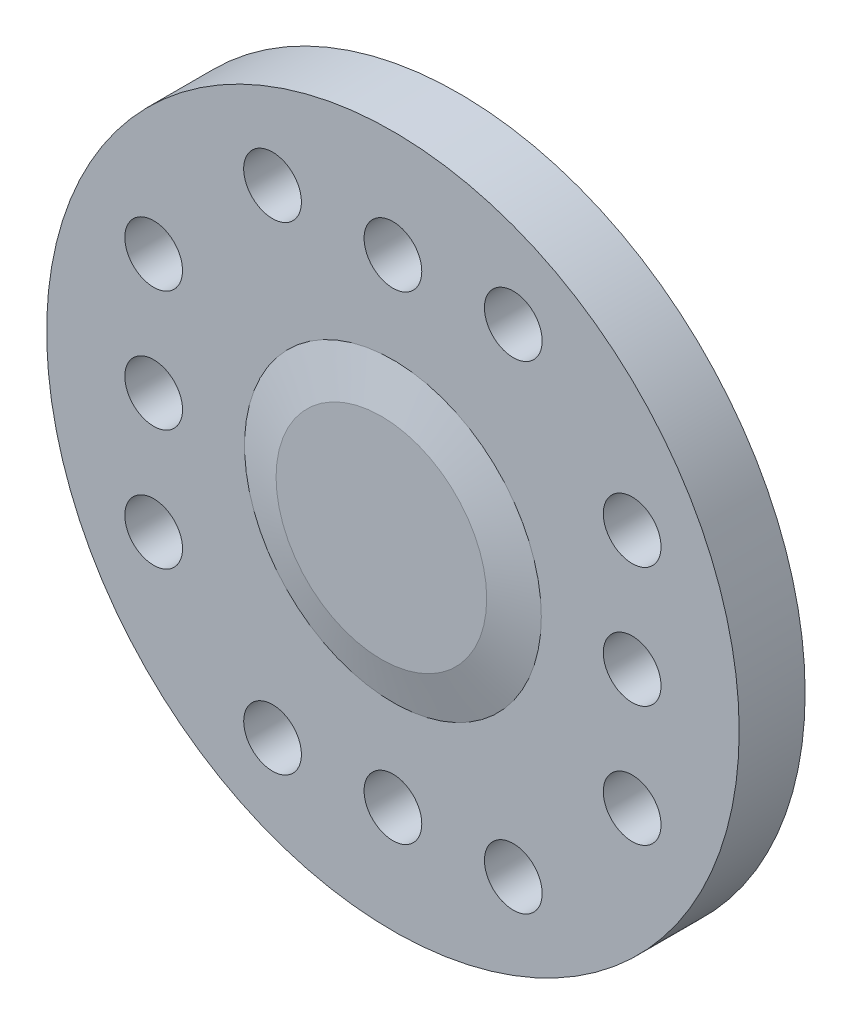
ISO-10303-21;
HEADER;
FILE_DESCRIPTION(('STEP AP214'),'2;1');
FILE_NAME('part.step','',(''),(''),'','','');
FILE_SCHEMA(('AUTOMOTIVE_DESIGN { 1 0 10303 214 1 1 1 1 }'));
ENDSEC;
DATA;
#1=APPLICATION_CONTEXT('core data for automotive mechanical design processes');
#2=APPLICATION_PROTOCOL_DEFINITION('international standard','automotive_design',2000,#1);
#3=PRODUCT_CONTEXT('',#1,'mechanical');
#4=PRODUCT('Part','Part','',(#3));
#5=PRODUCT_RELATED_PRODUCT_CATEGORY('part','',(#4));
#6=PRODUCT_DEFINITION_FORMATION('','',#4);
#7=PRODUCT_DEFINITION_CONTEXT('part definition',#1,'design');
#8=PRODUCT_DEFINITION('design','',#6,#7);
#9=PRODUCT_DEFINITION_SHAPE('','',#8);
#10=(LENGTH_UNIT() NAMED_UNIT(*) SI_UNIT(.MILLI.,.METRE.));
#11=(NAMED_UNIT(*) PLANE_ANGLE_UNIT() SI_UNIT($,.RADIAN.));
#12=(NAMED_UNIT(*) SI_UNIT($,.STERADIAN.) SOLID_ANGLE_UNIT());
#13=UNCERTAINTY_MEASURE_WITH_UNIT(LENGTH_MEASURE(1.E-05),#10,'distance_accuracy_value','');
#14=(GEOMETRIC_REPRESENTATION_CONTEXT(3) GLOBAL_UNCERTAINTY_ASSIGNED_CONTEXT((#13)) GLOBAL_UNIT_ASSIGNED_CONTEXT((#10,
#11,#12)) REPRESENTATION_CONTEXT('',''));
#15=CARTESIAN_POINT('',(0.,0.,0.));
#16=DIRECTION('',(0.,0.,1.));
#17=DIRECTION('',(1.,0.,0.));
#18=AXIS2_PLACEMENT_3D('',#15,#16,#17);
#19=CARTESIAN_POINT('',(0.,0.,0.));
#20=DIRECTION('',(0.,0.,1.));
#21=DIRECTION('',(1.,0.,0.));
#22=AXIS2_PLACEMENT_3D('',#19,#20,#21);
#23=PLANE('',#22);
#24=CARTESIAN_POINT('',(3.65,7.2545,0.));
#25=DIRECTION('',(0.,0.,1.));
#26=DIRECTION('',(-1.,0.,0.));
#27=AXIS2_PLACEMENT_3D('',#24,#25,#26);
#28=CIRCLE('',#27,0.874999999999999);
#29=CARTESIAN_POINT('',(2.775,7.2545,0.));
#30=VERTEX_POINT('',#29);
#31=EDGE_CURVE('E114',#30,#30,#28,.T.);
#32=ORIENTED_EDGE('',*,*,#31,.T.);
#33=EDGE_LOOP('',(#32));
#34=FACE_BOUND('',#33,.T.);
#35=CARTESIAN_POINT('',(-3.65,7.2545,0.));
#36=DIRECTION('',(0.,0.,1.));
#37=DIRECTION('',(1.,0.,0.));
#38=AXIS2_PLACEMENT_3D('',#35,#36,#37);
#39=CIRCLE('',#38,0.875000000000002);
#40=CARTESIAN_POINT('',(-2.775,7.2545,0.));
#41=VERTEX_POINT('',#40);
#42=EDGE_CURVE('E102',#41,#41,#39,.T.);
#43=ORIENTED_EDGE('',*,*,#42,.T.);
#44=EDGE_LOOP('',(#43));
#45=FACE_BOUND('',#44,.T.);
#46=CARTESIAN_POINT('',(-7.2545,0.,0.));
#47=DIRECTION('',(0.,0.,1.));
#48=DIRECTION('',(1.,0.,0.));
#49=AXIS2_PLACEMENT_3D('',#46,#47,#48);
#50=CIRCLE('',#49,0.875000000000002);
#51=CARTESIAN_POINT('',(-6.3795,0.,0.));
#52=VERTEX_POINT('',#51);
#53=EDGE_CURVE('E90',#52,#52,#50,.T.);
#54=ORIENTED_EDGE('',*,*,#53,.T.);
#55=EDGE_LOOP('',(#54));
#56=FACE_BOUND('',#55,.T.);
#57=CARTESIAN_POINT('',(-3.65,-7.2545,0.));
#58=DIRECTION('',(0.,0.,1.));
#59=DIRECTION('',(-1.,0.,0.));
#60=AXIS2_PLACEMENT_3D('',#57,#58,#59);
#61=CIRCLE('',#60,0.874999999999999);
#62=CARTESIAN_POINT('',(-4.525,-7.2545,0.));
#63=VERTEX_POINT('',#62);
#64=EDGE_CURVE('E78',#63,#63,#61,.T.);
#65=ORIENTED_EDGE('',*,*,#64,.T.);
#66=EDGE_LOOP('',(#65));
#67=FACE_BOUND('',#66,.T.);
#68=CARTESIAN_POINT('',(3.65,-7.2545,0.));
#69=DIRECTION('',(0.,0.,1.));
#70=DIRECTION('',(1.,0.,0.));
#71=AXIS2_PLACEMENT_3D('',#68,#69,#70);
#72=CIRCLE('',#71,0.875000000000001);
#73=CARTESIAN_POINT('',(4.525,-7.2545,0.));
#74=VERTEX_POINT('',#73);
#75=EDGE_CURVE('E66',#74,#74,#72,.T.);
#76=ORIENTED_EDGE('',*,*,#75,.T.);
#77=EDGE_LOOP('',(#76));
#78=FACE_BOUND('',#77,.T.);
#79=CARTESIAN_POINT('',(7.2545,0.,0.));
#80=DIRECTION('',(0.,0.,1.));
#81=DIRECTION('',(1.,0.,0.));
#82=AXIS2_PLACEMENT_3D('',#79,#80,#81);
#83=CIRCLE('',#82,0.875);
#84=CARTESIAN_POINT('',(8.1295,0.,0.));
#85=VERTEX_POINT('',#84);
#86=EDGE_CURVE('E54',#85,#85,#83,.T.);
#87=ORIENTED_EDGE('',*,*,#86,.T.);
#88=EDGE_LOOP('',(#87));
#89=FACE_BOUND('',#88,.T.);
#90=CARTESIAN_POINT('',(0.,0.,0.));
#91=DIRECTION('',(0.,0.,1.));
#92=DIRECTION('',(1.,0.,0.));
#93=AXIS2_PLACEMENT_3D('',#90,#91,#92);
#94=CIRCLE('',#93,10.5);
#95=CARTESIAN_POINT('',(10.5,0.,0.));
#96=VERTEX_POINT('',#95);
#97=EDGE_CURVE('E41',#96,#96,#94,.T.);
#98=ORIENTED_EDGE('',*,*,#97,.F.);
#99=EDGE_LOOP('',(#98));
#100=FACE_BOUND('',#99,.T.);
#101=CARTESIAN_POINT('',(7.2545,3.65,0.));
#102=DIRECTION('',(0.,0.,1.));
#103=DIRECTION('',(1.,0.,0.));
#104=AXIS2_PLACEMENT_3D('',#101,#102,#103);
#105=CIRCLE('',#104,0.874999999999998);
#106=CARTESIAN_POINT('',(8.1295,3.65,0.));
#107=VERTEX_POINT('',#106);
#108=EDGE_CURVE('E48',#107,#107,#105,.T.);
#109=ORIENTED_EDGE('',*,*,#108,.T.);
#110=EDGE_LOOP('',(#109));
#111=FACE_BOUND('',#110,.T.);
#112=CARTESIAN_POINT('',(7.2545,-3.65,0.));
#113=DIRECTION('',(0.,0.,1.));
#114=DIRECTION('',(-1.,0.,0.));
#115=AXIS2_PLACEMENT_3D('',#112,#113,#114);
#116=CIRCLE('',#115,0.874999999999998);
#117=CARTESIAN_POINT('',(6.3795,-3.65,0.));
#118=VERTEX_POINT('',#117);
#119=EDGE_CURVE('E60',#118,#118,#116,.T.);
#120=ORIENTED_EDGE('',*,*,#119,.T.);
#121=EDGE_LOOP('',(#120));
#122=FACE_BOUND('',#121,.T.);
#123=CARTESIAN_POINT('',(0.,-7.2545,0.));
#124=DIRECTION('',(0.,0.,1.));
#125=DIRECTION('',(1.,0.,0.));
#126=AXIS2_PLACEMENT_3D('',#123,#124,#125);
#127=CIRCLE('',#126,0.875000000000003);
#128=CARTESIAN_POINT('',(0.875000000000003,-7.2545,0.));
#129=VERTEX_POINT('',#128);
#130=EDGE_CURVE('E72',#129,#129,#127,.T.);
#131=ORIENTED_EDGE('',*,*,#130,.T.);
#132=EDGE_LOOP('',(#131));
#133=FACE_BOUND('',#132,.T.);
#134=CARTESIAN_POINT('',(-7.2545,-3.65,0.));
#135=DIRECTION('',(0.,0.,1.));
#136=DIRECTION('',(1.,0.,0.));
#137=AXIS2_PLACEMENT_3D('',#134,#135,#136);
#138=CIRCLE('',#137,0.875);
#139=CARTESIAN_POINT('',(-6.3795,-3.65,0.));
#140=VERTEX_POINT('',#139);
#141=EDGE_CURVE('E84',#140,#140,#138,.T.);
#142=ORIENTED_EDGE('',*,*,#141,.T.);
#143=EDGE_LOOP('',(#142));
#144=FACE_BOUND('',#143,.T.);
#145=CARTESIAN_POINT('',(-7.2545,3.65,0.));
#146=DIRECTION('',(0.,0.,1.));
#147=DIRECTION('',(-1.,0.,0.));
#148=AXIS2_PLACEMENT_3D('',#145,#146,#147);
#149=CIRCLE('',#148,0.875);
#150=CARTESIAN_POINT('',(-8.1295,3.65,0.));
#151=VERTEX_POINT('',#150);
#152=EDGE_CURVE('E96',#151,#151,#149,.T.);
#153=ORIENTED_EDGE('',*,*,#152,.T.);
#154=EDGE_LOOP('',(#153));
#155=FACE_BOUND('',#154,.T.);
#156=CARTESIAN_POINT('',(0.,7.2545,0.));
#157=DIRECTION('',(0.,0.,1.));
#158=DIRECTION('',(1.,0.,0.));
#159=AXIS2_PLACEMENT_3D('',#156,#157,#158);
#160=CIRCLE('',#159,0.875000000000003);
#161=CARTESIAN_POINT('',(0.875000000000002,7.2545,0.));
#162=VERTEX_POINT('',#161);
#163=EDGE_CURVE('E108',#162,#162,#160,.T.);
#164=ORIENTED_EDGE('',*,*,#163,.T.);
#165=EDGE_LOOP('',(#164));
#166=FACE_BOUND('',#165,.T.);
#167=CARTESIAN_POINT('',(0.,0.,0.));
#168=DIRECTION('',(0.,0.,1.));
#169=DIRECTION('',(1.,0.,0.));
#170=AXIS2_PLACEMENT_3D('',#167,#168,#169);
#171=CIRCLE('',#170,4.);
#172=CARTESIAN_POINT('',(4.,0.,0.));
#173=VERTEX_POINT('',#172);
#174=EDGE_CURVE('E10',#173,#173,#171,.F.);
#175=ORIENTED_EDGE('',*,*,#174,.F.);
#176=EDGE_LOOP('',(#175));
#177=FACE_BOUND('',#176,.T.);
#178=ADVANCED_FACE('F30',(#34,#45,#56,#67,#78,#89,#100,#111,#122,#133,#144,#155,#166,#177),#23,.F.);
#179=CARTESIAN_POINT('',(0.,0.,2.));
#180=DIRECTION('',(0.,0.,1.));
#181=DIRECTION('',(1.,0.,0.));
#182=AXIS2_PLACEMENT_3D('',#179,#180,#181);
#183=PLANE('',#182);
#184=CARTESIAN_POINT('',(3.65,7.2545,2.));
#185=DIRECTION('',(0.,0.,1.));
#186=DIRECTION('',(-1.,0.,0.));
#187=AXIS2_PLACEMENT_3D('',#184,#185,#186);
#188=CIRCLE('',#187,0.874999999999999);
#189=CARTESIAN_POINT('',(2.775,7.2545,2.));
#190=VERTEX_POINT('',#189);
#191=EDGE_CURVE('E111',#190,#190,#188,.T.);
#192=ORIENTED_EDGE('',*,*,#191,.F.);
#193=EDGE_LOOP('',(#192));
#194=FACE_BOUND('',#193,.T.);
#195=CARTESIAN_POINT('',(-3.65,7.2545,2.));
#196=DIRECTION('',(0.,0.,1.));
#197=DIRECTION('',(1.,0.,0.));
#198=AXIS2_PLACEMENT_3D('',#195,#196,#197);
#199=CIRCLE('',#198,0.875000000000002);
#200=CARTESIAN_POINT('',(-2.775,7.2545,2.));
#201=VERTEX_POINT('',#200);
#202=EDGE_CURVE('E99',#201,#201,#199,.T.);
#203=ORIENTED_EDGE('',*,*,#202,.F.);
#204=EDGE_LOOP('',(#203));
#205=FACE_BOUND('',#204,.T.);
#206=CARTESIAN_POINT('',(-7.2545,0.,2.));
#207=DIRECTION('',(0.,0.,1.));
#208=DIRECTION('',(1.,0.,0.));
#209=AXIS2_PLACEMENT_3D('',#206,#207,#208);
#210=CIRCLE('',#209,0.875000000000002);
#211=CARTESIAN_POINT('',(-6.3795,0.,2.));
#212=VERTEX_POINT('',#211);
#213=EDGE_CURVE('E87',#212,#212,#210,.T.);
#214=ORIENTED_EDGE('',*,*,#213,.F.);
#215=EDGE_LOOP('',(#214));
#216=FACE_BOUND('',#215,.T.);
#217=CARTESIAN_POINT('',(-3.65,-7.2545,2.));
#218=DIRECTION('',(0.,0.,1.));
#219=DIRECTION('',(-1.,0.,0.));
#220=AXIS2_PLACEMENT_3D('',#217,#218,#219);
#221=CIRCLE('',#220,0.874999999999999);
#222=CARTESIAN_POINT('',(-4.525,-7.2545,2.));
#223=VERTEX_POINT('',#222);
#224=EDGE_CURVE('E75',#223,#223,#221,.T.);
#225=ORIENTED_EDGE('',*,*,#224,.F.);
#226=EDGE_LOOP('',(#225));
#227=FACE_BOUND('',#226,.T.);
#228=CARTESIAN_POINT('',(3.65,-7.2545,2.));
#229=DIRECTION('',(0.,0.,1.));
#230=DIRECTION('',(1.,0.,0.));
#231=AXIS2_PLACEMENT_3D('',#228,#229,#230);
#232=CIRCLE('',#231,0.875000000000001);
#233=CARTESIAN_POINT('',(4.525,-7.2545,2.));
#234=VERTEX_POINT('',#233);
#235=EDGE_CURVE('E63',#234,#234,#232,.T.);
#236=ORIENTED_EDGE('',*,*,#235,.F.);
#237=EDGE_LOOP('',(#236));
#238=FACE_BOUND('',#237,.T.);
#239=CARTESIAN_POINT('',(7.2545,0.,2.));
#240=DIRECTION('',(0.,0.,1.));
#241=DIRECTION('',(1.,0.,0.));
#242=AXIS2_PLACEMENT_3D('',#239,#240,#241);
#243=CIRCLE('',#242,0.875);
#244=CARTESIAN_POINT('',(8.1295,0.,2.));
#245=VERTEX_POINT('',#244);
#246=EDGE_CURVE('E51',#245,#245,#243,.T.);
#247=ORIENTED_EDGE('',*,*,#246,.F.);
#248=EDGE_LOOP('',(#247));
#249=FACE_BOUND('',#248,.T.);
#250=CARTESIAN_POINT('',(0.,0.,2.));
#251=DIRECTION('',(0.,0.,1.));
#252=DIRECTION('',(1.,0.,0.));
#253=AXIS2_PLACEMENT_3D('',#250,#251,#252);
#254=CIRCLE('',#253,10.5);
#255=CARTESIAN_POINT('',(10.5,0.,2.));
#256=VERTEX_POINT('',#255);
#257=EDGE_CURVE('E37',#256,#256,#254,.T.);
#258=ORIENTED_EDGE('',*,*,#257,.T.);
#259=EDGE_LOOP('',(#258));
#260=FACE_BOUND('',#259,.T.);
#261=CARTESIAN_POINT('',(7.2545,3.65,2.));
#262=DIRECTION('',(0.,0.,1.));
#263=DIRECTION('',(1.,0.,0.));
#264=AXIS2_PLACEMENT_3D('',#261,#262,#263);
#265=CIRCLE('',#264,0.874999999999998);
#266=CARTESIAN_POINT('',(8.1295,3.65,2.));
#267=VERTEX_POINT('',#266);
#268=EDGE_CURVE('E46',#267,#267,#265,.T.);
#269=ORIENTED_EDGE('',*,*,#268,.F.);
#270=EDGE_LOOP('',(#269));
#271=FACE_BOUND('',#270,.T.);
#272=CARTESIAN_POINT('',(7.2545,-3.65,2.));
#273=DIRECTION('',(0.,0.,1.));
#274=DIRECTION('',(-1.,0.,0.));
#275=AXIS2_PLACEMENT_3D('',#272,#273,#274);
#276=CIRCLE('',#275,0.874999999999998);
#277=CARTESIAN_POINT('',(6.3795,-3.65,2.));
#278=VERTEX_POINT('',#277);
#279=EDGE_CURVE('E57',#278,#278,#276,.T.);
#280=ORIENTED_EDGE('',*,*,#279,.F.);
#281=EDGE_LOOP('',(#280));
#282=FACE_BOUND('',#281,.T.);
#283=CARTESIAN_POINT('',(0.,-7.2545,2.));
#284=DIRECTION('',(0.,0.,1.));
#285=DIRECTION('',(1.,0.,0.));
#286=AXIS2_PLACEMENT_3D('',#283,#284,#285);
#287=CIRCLE('',#286,0.875000000000003);
#288=CARTESIAN_POINT('',(0.875000000000003,-7.2545,2.));
#289=VERTEX_POINT('',#288);
#290=EDGE_CURVE('E69',#289,#289,#287,.T.);
#291=ORIENTED_EDGE('',*,*,#290,.F.);
#292=EDGE_LOOP('',(#291));
#293=FACE_BOUND('',#292,.T.);
#294=CARTESIAN_POINT('',(-7.2545,-3.65,2.));
#295=DIRECTION('',(0.,0.,1.));
#296=DIRECTION('',(1.,0.,0.));
#297=AXIS2_PLACEMENT_3D('',#294,#295,#296);
#298=CIRCLE('',#297,0.875);
#299=CARTESIAN_POINT('',(-6.3795,-3.65,2.));
#300=VERTEX_POINT('',#299);
#301=EDGE_CURVE('E81',#300,#300,#298,.T.);
#302=ORIENTED_EDGE('',*,*,#301,.F.);
#303=EDGE_LOOP('',(#302));
#304=FACE_BOUND('',#303,.T.);
#305=CARTESIAN_POINT('',(-7.2545,3.65,2.));
#306=DIRECTION('',(0.,0.,1.));
#307=DIRECTION('',(-1.,0.,0.));
#308=AXIS2_PLACEMENT_3D('',#305,#306,#307);
#309=CIRCLE('',#308,0.875);
#310=CARTESIAN_POINT('',(-8.1295,3.65,2.));
#311=VERTEX_POINT('',#310);
#312=EDGE_CURVE('E93',#311,#311,#309,.T.);
#313=ORIENTED_EDGE('',*,*,#312,.F.);
#314=EDGE_LOOP('',(#313));
#315=FACE_BOUND('',#314,.T.);
#316=CARTESIAN_POINT('',(0.,7.2545,2.));
#317=DIRECTION('',(0.,0.,1.));
#318=DIRECTION('',(1.,0.,0.));
#319=AXIS2_PLACEMENT_3D('',#316,#317,#318);
#320=CIRCLE('',#319,0.875000000000003);
#321=CARTESIAN_POINT('',(0.875000000000002,7.2545,2.));
#322=VERTEX_POINT('',#321);
#323=EDGE_CURVE('E105',#322,#322,#320,.T.);
#324=ORIENTED_EDGE('',*,*,#323,.F.);
#325=EDGE_LOOP('',(#324));
#326=FACE_BOUND('',#325,.T.);
#327=CARTESIAN_POINT('',(0.,0.,2.));
#328=DIRECTION('',(0.,0.,1.));
#329=DIRECTION('',(1.,0.,0.));
#330=AXIS2_PLACEMENT_3D('',#327,#328,#329);
#331=CIRCLE('',#330,4.5);
#332=CARTESIAN_POINT('',(4.5,0.,2.));
#333=VERTEX_POINT('',#332);
#334=EDGE_CURVE('E122',#333,#333,#331,.T.);
#335=ORIENTED_EDGE('',*,*,#334,.F.);
#336=EDGE_LOOP('',(#335));
#337=FACE_BOUND('',#336,.T.);
#338=ADVANCED_FACE('F160',(#194,#205,#216,#227,#238,#249,#260,#271,#282,#293,#304,#315,#326,
#337),#183,.T.);
#339=CARTESIAN_POINT('',(0.,0.,2.));
#340=DIRECTION('',(0.,0.,-1.));
#341=DIRECTION('',(-1.,0.,0.));
#342=AXIS2_PLACEMENT_3D('',#339,#340,#341);
#343=CYLINDRICAL_SURFACE('',#342,10.5);
#344=ORIENTED_EDGE('',*,*,#257,.F.);
#345=EDGE_LOOP('',(#344));
#346=FACE_BOUND('',#345,.T.);
#347=ORIENTED_EDGE('',*,*,#97,.T.);
#348=EDGE_LOOP('',(#347));
#349=FACE_BOUND('',#348,.T.);
#350=ADVANCED_FACE('F32',(#346,#349),#343,.T.);
#351=CARTESIAN_POINT('',(7.2545,3.65,2.));
#352=DIRECTION('',(0.,0.,-1.));
#353=DIRECTION('',(-1.,0.,0.));
#354=AXIS2_PLACEMENT_3D('',#351,#352,#353);
#355=CYLINDRICAL_SURFACE('',#354,0.874999999999998);
#356=ORIENTED_EDGE('',*,*,#268,.T.);
#357=EDGE_LOOP('',(#356));
#358=FACE_BOUND('',#357,.T.);
#359=ORIENTED_EDGE('',*,*,#108,.F.);
#360=EDGE_LOOP('',(#359));
#361=FACE_BOUND('',#360,.T.);
#362=ADVANCED_FACE('F169',(#358,#361),#355,.F.);
#363=CARTESIAN_POINT('',(7.2545,0.,2.));
#364=DIRECTION('',(0.,0.,-1.));
#365=DIRECTION('',(-1.,0.,0.));
#366=AXIS2_PLACEMENT_3D('',#363,#364,#365);
#367=CYLINDRICAL_SURFACE('',#366,0.875);
#368=ORIENTED_EDGE('',*,*,#246,.T.);
#369=EDGE_LOOP('',(#368));
#370=FACE_BOUND('',#369,.T.);
#371=ORIENTED_EDGE('',*,*,#86,.F.);
#372=EDGE_LOOP('',(#371));
#373=FACE_BOUND('',#372,.T.);
#374=ADVANCED_FACE('F172',(#370,#373),#367,.F.);
#375=CARTESIAN_POINT('',(7.2545,-3.65,2.));
#376=DIRECTION('',(0.,0.,-1.));
#377=DIRECTION('',(-1.,0.,0.));
#378=AXIS2_PLACEMENT_3D('',#375,#376,#377);
#379=CYLINDRICAL_SURFACE('',#378,0.874999999999998);
#380=ORIENTED_EDGE('',*,*,#279,.T.);
#381=EDGE_LOOP('',(#380));
#382=FACE_BOUND('',#381,.T.);
#383=ORIENTED_EDGE('',*,*,#119,.F.);
#384=EDGE_LOOP('',(#383));
#385=FACE_BOUND('',#384,.T.);
#386=ADVANCED_FACE('F176',(#382,#385),#379,.F.);
#387=CARTESIAN_POINT('',(3.65,-7.2545,2.));
#388=DIRECTION('',(0.,0.,-1.));
#389=DIRECTION('',(-1.,0.,0.));
#390=AXIS2_PLACEMENT_3D('',#387,#388,#389);
#391=CYLINDRICAL_SURFACE('',#390,0.875000000000001);
#392=ORIENTED_EDGE('',*,*,#235,.T.);
#393=EDGE_LOOP('',(#392));
#394=FACE_BOUND('',#393,.T.);
#395=ORIENTED_EDGE('',*,*,#75,.F.);
#396=EDGE_LOOP('',(#395));
#397=FACE_BOUND('',#396,.T.);
#398=ADVANCED_FACE('F180',(#394,#397),#391,.F.);
#399=CARTESIAN_POINT('',(0.,-7.2545,2.));
#400=DIRECTION('',(0.,0.,-1.));
#401=DIRECTION('',(-1.,0.,0.));
#402=AXIS2_PLACEMENT_3D('',#399,#400,#401);
#403=CYLINDRICAL_SURFACE('',#402,0.875000000000003);
#404=ORIENTED_EDGE('',*,*,#290,.T.);
#405=EDGE_LOOP('',(#404));
#406=FACE_BOUND('',#405,.T.);
#407=ORIENTED_EDGE('',*,*,#130,.F.);
#408=EDGE_LOOP('',(#407));
#409=FACE_BOUND('',#408,.T.);
#410=ADVANCED_FACE('F184',(#406,#409),#403,.F.);
#411=CARTESIAN_POINT('',(-3.65,-7.2545,2.));
#412=DIRECTION('',(0.,0.,-1.));
#413=DIRECTION('',(-1.,0.,0.));
#414=AXIS2_PLACEMENT_3D('',#411,#412,#413);
#415=CYLINDRICAL_SURFACE('',#414,0.874999999999999);
#416=ORIENTED_EDGE('',*,*,#224,.T.);
#417=EDGE_LOOP('',(#416));
#418=FACE_BOUND('',#417,.T.);
#419=ORIENTED_EDGE('',*,*,#64,.F.);
#420=EDGE_LOOP('',(#419));
#421=FACE_BOUND('',#420,.T.);
#422=ADVANCED_FACE('F188',(#418,#421),#415,.F.);
#423=CARTESIAN_POINT('',(-7.2545,-3.65,2.));
#424=DIRECTION('',(0.,0.,-1.));
#425=DIRECTION('',(-1.,0.,0.));
#426=AXIS2_PLACEMENT_3D('',#423,#424,#425);
#427=CYLINDRICAL_SURFACE('',#426,0.875);
#428=ORIENTED_EDGE('',*,*,#301,.T.);
#429=EDGE_LOOP('',(#428));
#430=FACE_BOUND('',#429,.T.);
#431=ORIENTED_EDGE('',*,*,#141,.F.);
#432=EDGE_LOOP('',(#431));
#433=FACE_BOUND('',#432,.T.);
#434=ADVANCED_FACE('F192',(#430,#433),#427,.F.);
#435=CARTESIAN_POINT('',(-7.2545,0.,2.));
#436=DIRECTION('',(0.,0.,-1.));
#437=DIRECTION('',(-1.,0.,0.));
#438=AXIS2_PLACEMENT_3D('',#435,#436,#437);
#439=CYLINDRICAL_SURFACE('',#438,0.875000000000002);
#440=ORIENTED_EDGE('',*,*,#213,.T.);
#441=EDGE_LOOP('',(#440));
#442=FACE_BOUND('',#441,.T.);
#443=ORIENTED_EDGE('',*,*,#53,.F.);
#444=EDGE_LOOP('',(#443));
#445=FACE_BOUND('',#444,.T.);
#446=ADVANCED_FACE('F196',(#442,#445),#439,.F.);
#447=CARTESIAN_POINT('',(-7.2545,3.65,2.));
#448=DIRECTION('',(0.,0.,-1.));
#449=DIRECTION('',(-1.,0.,0.));
#450=AXIS2_PLACEMENT_3D('',#447,#448,#449);
#451=CYLINDRICAL_SURFACE('',#450,0.875);
#452=ORIENTED_EDGE('',*,*,#312,.T.);
#453=EDGE_LOOP('',(#452));
#454=FACE_BOUND('',#453,.T.);
#455=ORIENTED_EDGE('',*,*,#152,.F.);
#456=EDGE_LOOP('',(#455));
#457=FACE_BOUND('',#456,.T.);
#458=ADVANCED_FACE('F200',(#454,#457),#451,.F.);
#459=CARTESIAN_POINT('',(-3.65,7.2545,2.));
#460=DIRECTION('',(0.,0.,-1.));
#461=DIRECTION('',(-1.,0.,0.));
#462=AXIS2_PLACEMENT_3D('',#459,#460,#461);
#463=CYLINDRICAL_SURFACE('',#462,0.875000000000002);
#464=ORIENTED_EDGE('',*,*,#202,.T.);
#465=EDGE_LOOP('',(#464));
#466=FACE_BOUND('',#465,.T.);
#467=ORIENTED_EDGE('',*,*,#42,.F.);
#468=EDGE_LOOP('',(#467));
#469=FACE_BOUND('',#468,.T.);
#470=ADVANCED_FACE('F204',(#466,#469),#463,.F.);
#471=CARTESIAN_POINT('',(0.,7.2545,2.));
#472=DIRECTION('',(0.,0.,-1.));
#473=DIRECTION('',(-1.,0.,0.));
#474=AXIS2_PLACEMENT_3D('',#471,#472,#473);
#475=CYLINDRICAL_SURFACE('',#474,0.875000000000003);
#476=ORIENTED_EDGE('',*,*,#323,.T.);
#477=EDGE_LOOP('',(#476));
#478=FACE_BOUND('',#477,.T.);
#479=ORIENTED_EDGE('',*,*,#163,.F.);
#480=EDGE_LOOP('',(#479));
#481=FACE_BOUND('',#480,.T.);
#482=ADVANCED_FACE('F208',(#478,#481),#475,.F.);
#483=CARTESIAN_POINT('',(3.65,7.2545,2.));
#484=DIRECTION('',(0.,0.,-1.));
#485=DIRECTION('',(-1.,0.,0.));
#486=AXIS2_PLACEMENT_3D('',#483,#484,#485);
#487=CYLINDRICAL_SURFACE('',#486,0.874999999999999);
#488=ORIENTED_EDGE('',*,*,#191,.T.);
#489=EDGE_LOOP('',(#488));
#490=FACE_BOUND('',#489,.T.);
#491=ORIENTED_EDGE('',*,*,#31,.F.);
#492=EDGE_LOOP('',(#491));
#493=FACE_BOUND('',#492,.T.);
#494=ADVANCED_FACE('F212',(#490,#493),#487,.F.);
#495=CARTESIAN_POINT('',(0.,0.,2.));
#496=DIRECTION('',(0.,0.,-1.));
#497=DIRECTION('',(1.,0.,0.));
#498=AXIS2_PLACEMENT_3D('',#495,#496,#497);
#499=CONICAL_SURFACE('',#498,4.5,1.30899693899575);
#500=CARTESIAN_POINT('',(0.,0.,2.35));
#501=DIRECTION('',(0.,0.,1.));
#502=DIRECTION('',(1.,0.,0.));
#503=AXIS2_PLACEMENT_3D('',#500,#501,#502);
#504=CIRCLE('',#503,3.19378221735088);
#505=CARTESIAN_POINT('',(3.19378221735088,0.,2.35));
#506=VERTEX_POINT('',#505);
#507=EDGE_CURVE('E117',#506,#506,#504,.T.);
#508=ORIENTED_EDGE('',*,*,#507,.F.);
#509=EDGE_LOOP('',(#508));
#510=FACE_BOUND('',#509,.T.);
#511=ORIENTED_EDGE('',*,*,#334,.T.);
#512=EDGE_LOOP('',(#511));
#513=FACE_BOUND('',#512,.T.);
#514=ADVANCED_FACE('F156',(#510,#513),#499,.T.);
#515=CARTESIAN_POINT('',(0.,0.,2.35));
#516=DIRECTION('',(0.,0.,1.));
#517=DIRECTION('',(1.,0.,0.));
#518=AXIS2_PLACEMENT_3D('',#515,#516,#517);
#519=PLANE('',#518);
#520=ORIENTED_EDGE('',*,*,#507,.T.);
#521=EDGE_LOOP('',(#520));
#522=FACE_BOUND('',#521,.T.);
#523=ADVANCED_FACE('F151',(#522),#519,.T.);
#524=CARTESIAN_POINT('',(0.,0.,-3.4));
#525=DIRECTION('',(0.,0.,1.));
#526=DIRECTION('',(1.,0.,0.));
#527=AXIS2_PLACEMENT_3D('',#524,#525,#526);
#528=CYLINDRICAL_SURFACE('',#527,4.);
#529=CARTESIAN_POINT('',(0.,0.,-3.4));
#530=DIRECTION('',(0.,0.,-1.));
#531=DIRECTION('',(-1.,0.,0.));
#532=AXIS2_PLACEMENT_3D('',#529,#530,#531);
#533=CIRCLE('',#532,4.);
#534=CARTESIAN_POINT('',(-4.,0.,-3.4));
#535=VERTEX_POINT('',#534);
#536=EDGE_CURVE('E125',#535,#535,#533,.T.);
#537=ORIENTED_EDGE('',*,*,#536,.F.);
#538=EDGE_LOOP('',(#537));
#539=FACE_BOUND('',#538,.T.);
#540=ORIENTED_EDGE('',*,*,#174,.T.);
#541=EDGE_LOOP('',(#540));
#542=FACE_BOUND('',#541,.T.);
#543=ADVANCED_FACE('F146',(#539,#542),#528,.T.);
#544=CARTESIAN_POINT('',(0.,0.,-3.4));
#545=DIRECTION('',(0.,0.,-1.));
#546=DIRECTION('',(-1.,0.,0.));
#547=AXIS2_PLACEMENT_3D('',#544,#545,#546);
#548=PLANE('',#547);
#549=CARTESIAN_POINT('',(0.,0.,-3.4));
#550=DIRECTION('',(0.,0.,-1.));
#551=DIRECTION('',(-1.,0.,0.));
#552=AXIS2_PLACEMENT_3D('',#549,#550,#551);
#553=CIRCLE('',#552,2.85);
#554=CARTESIAN_POINT('',(-2.85,0.,-3.4));
#555=VERTEX_POINT('',#554);
#556=EDGE_CURVE('E129',#555,#555,#553,.T.);
#557=ORIENTED_EDGE('',*,*,#556,.F.);
#558=EDGE_LOOP('',(#557));
#559=FACE_BOUND('',#558,.T.);
#560=ORIENTED_EDGE('',*,*,#536,.T.);
#561=EDGE_LOOP('',(#560));
#562=FACE_BOUND('',#561,.T.);
#563=ADVANCED_FACE('F140',(#559,#562),#548,.T.);
#564=CARTESIAN_POINT('',(0.,0.,0.4));
#565=DIRECTION('',(0.,0.,-1.));
#566=DIRECTION('',(-1.,0.,0.));
#567=AXIS2_PLACEMENT_3D('',#564,#565,#566);
#568=CYLINDRICAL_SURFACE('',#567,2.85);
#569=CARTESIAN_POINT('',(0.,0.,0.4));
#570=DIRECTION('',(0.,0.,-1.));
#571=DIRECTION('',(-1.,0.,0.));
#572=AXIS2_PLACEMENT_3D('',#569,#570,#571);
#573=CIRCLE('',#572,2.85);
#574=CARTESIAN_POINT('',(-2.85,0.,0.4));
#575=VERTEX_POINT('',#574);
#576=EDGE_CURVE('E128',#575,#575,#573,.T.);
#577=CARTESIAN_POINT('',(-2.85,0.,0.4));
#578=CARTESIAN_POINT('',(-2.85,0.,0.360416666666667));
#579=CARTESIAN_POINT('',(-2.85,0.,0.320833333333334));
#580=CARTESIAN_POINT('',(-2.85,0.,0.241666666666667));
#581=CARTESIAN_POINT('',(-2.85,0.,0.202083333333334));
#582=CARTESIAN_POINT('',(-2.85,0.,0.122916666666667));
#583=CARTESIAN_POINT('',(-2.85,0.,0.0833333333333336));
#584=CARTESIAN_POINT('',(-2.85,0.,0.00416666666666688));
#585=CARTESIAN_POINT('',(-2.85,0.,-0.0354166666666665));
#586=CARTESIAN_POINT('',(-2.85,0.,-0.114583333333333));
#587=CARTESIAN_POINT('',(-2.85,0.,-0.154166666666666));
#588=CARTESIAN_POINT('',(-2.85,0.,-0.233333333333333));
#589=CARTESIAN_POINT('',(-2.85,0.,-0.272916666666666));
#590=CARTESIAN_POINT('',(-2.85,0.,-0.352083333333333));
#591=CARTESIAN_POINT('',(-2.85,0.,-0.391666666666666));
#592=CARTESIAN_POINT('',(-2.85,0.,-0.470833333333333));
#593=CARTESIAN_POINT('',(-2.85,0.,-0.510416666666667));
#594=CARTESIAN_POINT('',(-2.85,0.,-0.589583333333333));
#595=CARTESIAN_POINT('',(-2.85,0.,-0.629166666666666));
#596=CARTESIAN_POINT('',(-2.85,0.,-0.708333333333333));
#597=CARTESIAN_POINT('',(-2.85,0.,-0.747916666666666));
#598=CARTESIAN_POINT('',(-2.85,0.,-0.827083333333333));
#599=CARTESIAN_POINT('',(-2.85,0.,-0.866666666666666));
#600=CARTESIAN_POINT('',(-2.85,0.,-0.945833333333333));
#601=CARTESIAN_POINT('',(-2.85,0.,-0.985416666666666));
#602=CARTESIAN_POINT('',(-2.85,0.,-1.06458333333333));
#603=CARTESIAN_POINT('',(-2.85,0.,-1.10416666666667));
#604=CARTESIAN_POINT('',(-2.85,0.,-1.18333333333333));
#605=CARTESIAN_POINT('',(-2.85,0.,-1.22291666666667));
#606=CARTESIAN_POINT('',(-2.85,0.,-1.30208333333333));
#607=CARTESIAN_POINT('',(-2.85,0.,-1.34166666666667));
#608=CARTESIAN_POINT('',(-2.85,0.,-1.42083333333333));
#609=CARTESIAN_POINT('',(-2.85,0.,-1.46041666666667));
#610=CARTESIAN_POINT('',(-2.85,0.,-1.53958333333333));
#611=CARTESIAN_POINT('',(-2.85,0.,-1.57916666666667));
#612=CARTESIAN_POINT('',(-2.85,0.,-1.65833333333333));
#613=CARTESIAN_POINT('',(-2.85,0.,-1.69791666666667));
#614=CARTESIAN_POINT('',(-2.85,0.,-1.77708333333333));
#615=CARTESIAN_POINT('',(-2.85,0.,-1.81666666666667));
#616=CARTESIAN_POINT('',(-2.85,0.,-1.89583333333333));
#617=CARTESIAN_POINT('',(-2.85,0.,-1.93541666666667));
#618=CARTESIAN_POINT('',(-2.85,0.,-2.01458333333333));
#619=CARTESIAN_POINT('',(-2.85,0.,-2.05416666666667));
#620=CARTESIAN_POINT('',(-2.85,0.,-2.13333333333333));
#621=CARTESIAN_POINT('',(-2.85,0.,-2.17291666666667));
#622=CARTESIAN_POINT('',(-2.85,0.,-2.25208333333333));
#623=CARTESIAN_POINT('',(-2.85,0.,-2.29166666666667));
#624=CARTESIAN_POINT('',(-2.85,0.,-2.37083333333333));
#625=CARTESIAN_POINT('',(-2.85,0.,-2.41041666666667));
#626=CARTESIAN_POINT('',(-2.85,0.,-2.48958333333333));
#627=CARTESIAN_POINT('',(-2.85,0.,-2.52916666666667));
#628=CARTESIAN_POINT('',(-2.85,0.,-2.60833333333333));
#629=CARTESIAN_POINT('',(-2.85,0.,-2.64791666666667));
#630=CARTESIAN_POINT('',(-2.85,0.,-2.72708333333333));
#631=CARTESIAN_POINT('',(-2.85,0.,-2.76666666666667));
#632=CARTESIAN_POINT('',(-2.85,0.,-2.84583333333333));
#633=CARTESIAN_POINT('',(-2.85,0.,-2.88541666666667));
#634=CARTESIAN_POINT('',(-2.85,0.,-2.96458333333333));
#635=CARTESIAN_POINT('',(-2.85,0.,-3.00416666666667));
#636=CARTESIAN_POINT('',(-2.85,0.,-3.08333333333333));
#637=CARTESIAN_POINT('',(-2.85,0.,-3.12291666666667));
#638=CARTESIAN_POINT('',(-2.85,0.,-3.20208333333333));
#639=CARTESIAN_POINT('',(-2.85,0.,-3.24166666666667));
#640=CARTESIAN_POINT('',(-2.85,0.,-3.32083333333333));
#641=CARTESIAN_POINT('',(-2.85,0.,-3.36041666666667));
#642=CARTESIAN_POINT('',(-2.85,0.,-3.4));
#643=B_SPLINE_CURVE_WITH_KNOTS('',3,(#577,#578,#579,#580,#581,#582,#583,#584,#585,#586,#587,
#588,#589,#590,#591,#592,#593,#594,#595,#596,#597,#598,#599,#600,#601,#602,#603,#604,#605,#606,
#607,#608,#609,#610,#611,#612,#613,#614,#615,#616,#617,#618,#619,#620,#621,#622,#623,#624,#625,
#626,#627,#628,#629,#630,#631,#632,#633,#634,#635,#636,#637,#638,#639,#640,#641,#642),
.UNSPECIFIED.,.F.,.F.,(4,2,2,2,2,2,2,2,2,2,2,2,2,2,2,2,2,2,2,2,2,2,2,2,2,2,2,2,2,2,2,2,4),(0.,
0.11875,0.2375,0.35625,0.475,0.59375,0.7125,0.83125,0.95,1.06875,1.1875,1.30625,1.425,1.54375,
1.6625,1.78125,1.9,2.01875,2.1375,2.25625,2.375,2.49375,2.6125,2.73125,2.85,2.96875,3.0875,
3.20625,3.325,3.44375,3.5625,3.68125,3.8),.UNSPECIFIED.);
#644=EDGE_CURVE('BSEAM137',#575,#555,#643,.T.);
#645=ORIENTED_EDGE('',*,*,#576,.F.);
#646=ORIENTED_EDGE('',*,*,#556,.T.);
#647=ORIENTED_EDGE('',*,*,#644,.T.);
#648=ORIENTED_EDGE('',*,*,#644,.F.);
#649=EDGE_LOOP('',(#645,#647,#646,#648));
#650=FACE_BOUND('',#649,.T.);
#651=ADVANCED_FACE('F137',(#650),#568,.F.);
#652=CARTESIAN_POINT('',(0.,0.,0.4));
#653=DIRECTION('',(0.,0.,-1.));
#654=DIRECTION('',(-1.,0.,0.));
#655=AXIS2_PLACEMENT_3D('',#652,#653,#654);
#656=PLANE('',#655);
#657=ORIENTED_EDGE('',*,*,#576,.T.);
#658=EDGE_LOOP('',(#657));
#659=FACE_BOUND('',#658,.T.);
#660=ADVANCED_FACE('F135',(#659),#656,.T.);
#661=CLOSED_SHELL('',(#178,#338,#350,#362,#374,#386,#398,#410,#422,#434,#446,#458,#470,#482,
#494,#514,#523,#543,#563,#651,#660));
#662=MANIFOLD_SOLID_BREP('B2',#661);
#663=ADVANCED_BREP_SHAPE_REPRESENTATION('',(#18,#662),#14);
#664=SHAPE_DEFINITION_REPRESENTATION(#9,#663);
ENDSEC;
END-ISO-10303-21;
